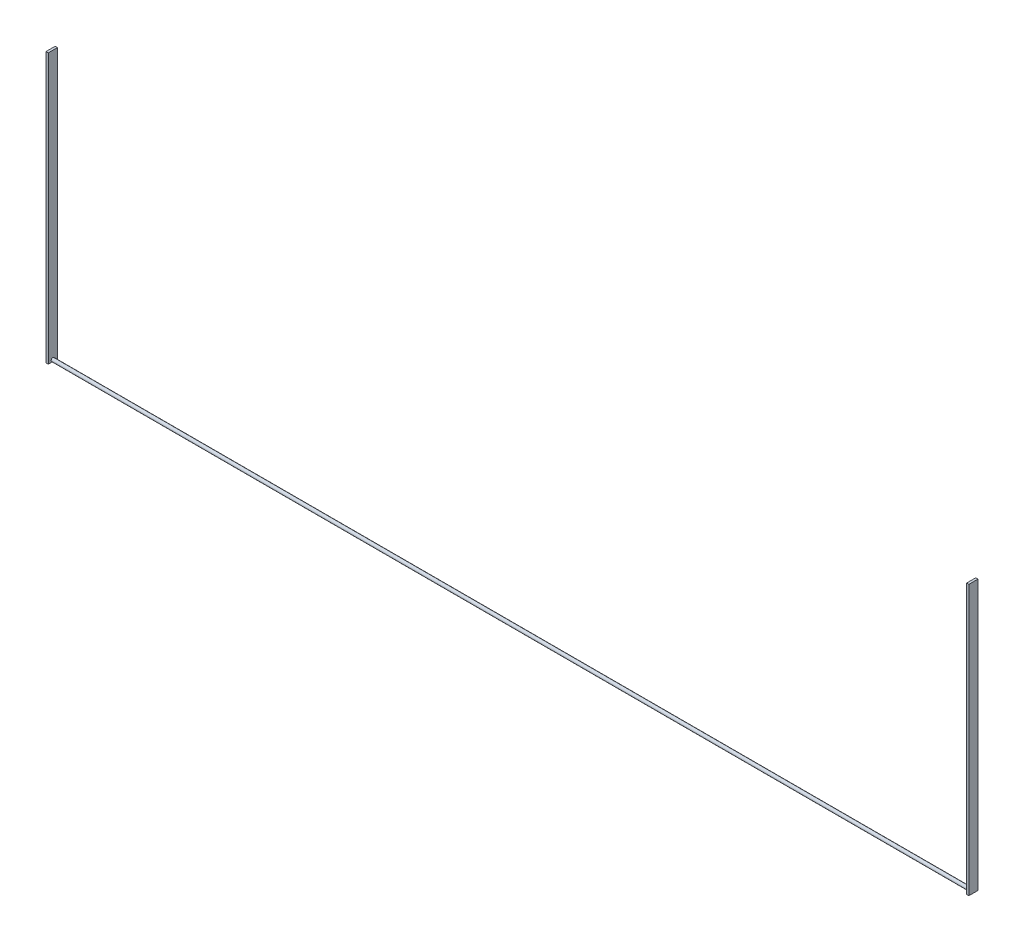
ISO-10303-21;
HEADER;
FILE_DESCRIPTION(('STEP AP214'),'2;1');
FILE_NAME('part.step','',(''),(''),'','','');
FILE_SCHEMA(('AUTOMOTIVE_DESIGN { 1 0 10303 214 1 1 1 1 }'));
ENDSEC;
DATA;
#1=APPLICATION_CONTEXT('core data for automotive mechanical design processes');
#2=APPLICATION_PROTOCOL_DEFINITION('international standard','automotive_design',2000,#1);
#3=PRODUCT_CONTEXT('',#1,'mechanical');
#4=PRODUCT('Part','Part','',(#3));
#5=PRODUCT_RELATED_PRODUCT_CATEGORY('part','',(#4));
#6=PRODUCT_DEFINITION_FORMATION('','',#4);
#7=PRODUCT_DEFINITION_CONTEXT('part definition',#1,'design');
#8=PRODUCT_DEFINITION('design','',#6,#7);
#9=PRODUCT_DEFINITION_SHAPE('','',#8);
#10=(LENGTH_UNIT() NAMED_UNIT(*) SI_UNIT(.MILLI.,.METRE.));
#11=(NAMED_UNIT(*) PLANE_ANGLE_UNIT() SI_UNIT($,.RADIAN.));
#12=(NAMED_UNIT(*) SI_UNIT($,.STERADIAN.) SOLID_ANGLE_UNIT());
#13=UNCERTAINTY_MEASURE_WITH_UNIT(LENGTH_MEASURE(1.E-05),#10,'distance_accuracy_value','');
#14=(GEOMETRIC_REPRESENTATION_CONTEXT(3) GLOBAL_UNCERTAINTY_ASSIGNED_CONTEXT((#13)) GLOBAL_UNIT_ASSIGNED_CONTEXT((#10,
#11,#12)) REPRESENTATION_CONTEXT('',''));
#15=CARTESIAN_POINT('',(0.,0.,0.));
#16=DIRECTION('',(0.,0.,1.));
#17=DIRECTION('',(1.,0.,0.));
#18=AXIS2_PLACEMENT_3D('',#15,#16,#17);
#19=CARTESIAN_POINT('',(6.35,0.,25.4));
#20=DIRECTION('',(0.,1.,0.));
#21=DIRECTION('',(0.,0.,1.));
#22=AXIS2_PLACEMENT_3D('',#19,#20,#21);
#23=PLANE('',#22);
#24=DIRECTION('',(1.,0.,0.));
#25=VECTOR('',#24,1.);
#26=CARTESIAN_POINT('',(6.35,0.,0.));
#27=LINE('',#26,#25);
#28=CARTESIAN_POINT('',(0.,0.,0.));
#29=VERTEX_POINT('',#28);
#30=CARTESIAN_POINT('',(6.35,0.,0.));
#31=VERTEX_POINT('',#30);
#32=EDGE_CURVE('E138',#29,#31,#27,.T.);
#33=ORIENTED_EDGE('',*,*,#32,.T.);
#34=DIRECTION('',(0.,0.,-1.));
#35=VECTOR('',#34,1.);
#36=CARTESIAN_POINT('',(6.35,0.,25.4));
#37=LINE('',#36,#35);
#38=CARTESIAN_POINT('',(6.35,0.,25.4));
#39=VERTEX_POINT('',#38);
#40=EDGE_CURVE('E43',#39,#31,#37,.T.);
#41=ORIENTED_EDGE('',*,*,#40,.F.);
#42=DIRECTION('',(1.,0.,0.));
#43=VECTOR('',#42,1.);
#44=CARTESIAN_POINT('',(6.35,0.,25.4));
#45=LINE('',#44,#43);
#46=CARTESIAN_POINT('',(0.,0.,25.4));
#47=VERTEX_POINT('',#46);
#48=EDGE_CURVE('E144',#47,#39,#45,.T.);
#49=ORIENTED_EDGE('',*,*,#48,.F.);
#50=DIRECTION('',(0.,0.,-1.));
#51=VECTOR('',#50,1.);
#52=CARTESIAN_POINT('',(0.,0.,25.4));
#53=LINE('',#52,#51);
#54=EDGE_CURVE('E150',#47,#29,#53,.T.);
#55=ORIENTED_EDGE('',*,*,#54,.T.);
#56=EDGE_LOOP('',(#33,#41,#49,#55));
#57=FACE_BOUND('',#56,.T.);
#58=ADVANCED_FACE('F35',(#57),#23,.F.);
#59=CARTESIAN_POINT('',(6.35000000000001,750.,25.4));
#60=DIRECTION('',(-1.,0.,0.));
#61=DIRECTION('',(0.,-1.,0.));
#62=AXIS2_PLACEMENT_3D('',#59,#60,#61);
#63=PLANE('',#62);
#64=CARTESIAN_POINT('',(6.34999999999986,5.,12.7));
#65=DIRECTION('',(-1.,0.,0.));
#66=DIRECTION('',(0.,-1.,0.));
#67=AXIS2_PLACEMENT_3D('',#64,#65,#66);
#68=CIRCLE('',#67,4.7625);
#69=CARTESIAN_POINT('',(6.34999999999986,0.237500000000001,12.7));
#70=VERTEX_POINT('',#69);
#71=EDGE_CURVE('E11',#70,#70,#68,.F.);
#72=ORIENTED_EDGE('',*,*,#71,.F.);
#73=EDGE_LOOP('',(#72));
#74=FACE_BOUND('',#73,.T.);
#75=DIRECTION('',(0.,1.,0.));
#76=VECTOR('',#75,1.);
#77=CARTESIAN_POINT('',(6.35000000000001,750.,0.));
#78=LINE('',#77,#76);
#79=CARTESIAN_POINT('',(6.35000000000001,750.,0.));
#80=VERTEX_POINT('',#79);
#81=EDGE_CURVE('E153',#31,#80,#78,.T.);
#82=ORIENTED_EDGE('',*,*,#81,.T.);
#83=DIRECTION('',(0.,0.,-1.));
#84=VECTOR('',#83,1.);
#85=CARTESIAN_POINT('',(6.35000000000001,750.,25.4));
#86=LINE('',#85,#84);
#87=CARTESIAN_POINT('',(6.35000000000001,750.,25.4));
#88=VERTEX_POINT('',#87);
#89=EDGE_CURVE('E160',#88,#80,#86,.T.);
#90=ORIENTED_EDGE('',*,*,#89,.F.);
#91=DIRECTION('',(0.,1.,0.));
#92=VECTOR('',#91,1.);
#93=CARTESIAN_POINT('',(6.35000000000001,750.,25.4));
#94=LINE('',#93,#92);
#95=EDGE_CURVE('E83',#39,#88,#94,.T.);
#96=ORIENTED_EDGE('',*,*,#95,.F.);
#97=ORIENTED_EDGE('',*,*,#40,.T.);
#98=EDGE_LOOP('',(#82,#90,#96,#97));
#99=FACE_BOUND('',#98,.T.);
#100=ADVANCED_FACE('F162',(#74,#99),#63,.F.);
#101=CARTESIAN_POINT('',(0.,750.,25.4));
#102=DIRECTION('',(0.,-1.,0.));
#103=DIRECTION('',(0.,0.,-1.));
#104=AXIS2_PLACEMENT_3D('',#101,#102,#103);
#105=PLANE('',#104);
#106=DIRECTION('',(-1.,0.,0.));
#107=VECTOR('',#106,1.);
#108=CARTESIAN_POINT('',(0.,750.,0.));
#109=LINE('',#108,#107);
#110=CARTESIAN_POINT('',(0.,750.,0.));
#111=VERTEX_POINT('',#110);
#112=EDGE_CURVE('E69',#80,#111,#109,.T.);
#113=ORIENTED_EDGE('',*,*,#112,.T.);
#114=DIRECTION('',(0.,0.,-1.));
#115=VECTOR('',#114,1.);
#116=CARTESIAN_POINT('',(0.,750.,25.4));
#117=LINE('',#116,#115);
#118=CARTESIAN_POINT('',(0.,750.,25.4));
#119=VERTEX_POINT('',#118);
#120=EDGE_CURVE('E158',#119,#111,#117,.T.);
#121=ORIENTED_EDGE('',*,*,#120,.F.);
#122=DIRECTION('',(-1.,0.,0.));
#123=VECTOR('',#122,1.);
#124=CARTESIAN_POINT('',(0.,750.,25.4));
#125=LINE('',#124,#123);
#126=EDGE_CURVE('E147',#88,#119,#125,.T.);
#127=ORIENTED_EDGE('',*,*,#126,.F.);
#128=ORIENTED_EDGE('',*,*,#89,.T.);
#129=EDGE_LOOP('',(#113,#121,#127,#128));
#130=FACE_BOUND('',#129,.T.);
#131=ADVANCED_FACE('F185',(#130),#105,.F.);
#132=CARTESIAN_POINT('',(0.,0.,25.4));
#133=DIRECTION('',(1.,0.,0.));
#134=DIRECTION('',(0.,0.,-1.));
#135=AXIS2_PLACEMENT_3D('',#132,#133,#134);
#136=PLANE('',#135);
#137=DIRECTION('',(0.,-1.,0.));
#138=VECTOR('',#137,1.);
#139=CARTESIAN_POINT('',(0.,0.,0.));
#140=LINE('',#139,#138);
#141=EDGE_CURVE('E75',#111,#29,#140,.T.);
#142=ORIENTED_EDGE('',*,*,#141,.T.);
#143=ORIENTED_EDGE('',*,*,#54,.F.);
#144=DIRECTION('',(0.,-1.,0.));
#145=VECTOR('',#144,1.);
#146=CARTESIAN_POINT('',(0.,0.,25.4));
#147=LINE('',#146,#145);
#148=EDGE_CURVE('E51',#119,#47,#147,.T.);
#149=ORIENTED_EDGE('',*,*,#148,.F.);
#150=ORIENTED_EDGE('',*,*,#120,.T.);
#151=EDGE_LOOP('',(#142,#143,#149,#150));
#152=FACE_BOUND('',#151,.T.);
#153=ADVANCED_FACE('F178',(#152),#136,.F.);
#154=CARTESIAN_POINT('',(0.,0.,25.4));
#155=DIRECTION('',(0.,0.,-1.));
#156=DIRECTION('',(-1.,0.,0.));
#157=AXIS2_PLACEMENT_3D('',#154,#155,#156);
#158=PLANE('',#157);
#159=ORIENTED_EDGE('',*,*,#48,.T.);
#160=ORIENTED_EDGE('',*,*,#95,.T.);
#161=ORIENTED_EDGE('',*,*,#126,.T.);
#162=ORIENTED_EDGE('',*,*,#148,.T.);
#163=EDGE_LOOP('',(#159,#160,#161,#162));
#164=FACE_BOUND('',#163,.T.);
#165=ADVANCED_FACE('F170',(#164),#158,.F.);
#166=CARTESIAN_POINT('',(0.,0.,0.));
#167=DIRECTION('',(0.,0.,-1.));
#168=DIRECTION('',(-1.,0.,0.));
#169=AXIS2_PLACEMENT_3D('',#166,#167,#168);
#170=PLANE('',#169);
#171=ORIENTED_EDGE('',*,*,#32,.F.);
#172=ORIENTED_EDGE('',*,*,#141,.F.);
#173=ORIENTED_EDGE('',*,*,#112,.F.);
#174=ORIENTED_EDGE('',*,*,#81,.F.);
#175=EDGE_LOOP('',(#171,#172,#173,#174));
#176=FACE_BOUND('',#175,.T.);
#177=ADVANCED_FACE('F167',(#176),#170,.T.);
#178=CARTESIAN_POINT('',(2573.8203841816,5.00000000000029,12.7));
#179=DIRECTION('',(-1.,0.,0.));
#180=DIRECTION('',(0.,-1.,0.));
#181=AXIS2_PLACEMENT_3D('',#178,#179,#180);
#182=CYLINDRICAL_SURFACE('',#181,4.7625);
#183=ORIENTED_EDGE('',*,*,#71,.T.);
#184=EDGE_LOOP('',(#183));
#185=FACE_BOUND('',#184,.T.);
#186=CARTESIAN_POINT('',(2560.35,5.00000000000028,12.7));
#187=DIRECTION('',(1.,0.,0.));
#188=DIRECTION('',(0.,1.,0.));
#189=AXIS2_PLACEMENT_3D('',#186,#187,#188);
#190=CIRCLE('',#189,4.7625);
#191=CARTESIAN_POINT('',(2560.35,9.76250000000029,12.7));
#192=VERTEX_POINT('',#191);
#193=EDGE_CURVE('E135',#192,#192,#190,.T.);
#194=ORIENTED_EDGE('',*,*,#193,.F.);
#195=EDGE_LOOP('',(#194));
#196=FACE_BOUND('',#195,.T.);
#197=ADVANCED_FACE('F169',(#185,#196),#182,.T.);
#198=CARTESIAN_POINT('',(2560.35,750.,25.4));
#199=DIRECTION('',(1.,0.,0.));
#200=DIRECTION('',(0.,1.,0.));
#201=AXIS2_PLACEMENT_3D('',#198,#199,#200);
#202=PLANE('',#201);
#203=ORIENTED_EDGE('',*,*,#193,.T.);
#204=EDGE_LOOP('',(#203));
#205=FACE_BOUND('',#204,.T.);
#206=DIRECTION('',(0.,-1.,0.));
#207=VECTOR('',#206,1.);
#208=CARTESIAN_POINT('',(2560.35,750.,0.));
#209=LINE('',#208,#207);
#210=CARTESIAN_POINT('',(2560.35,750.,0.));
#211=VERTEX_POINT('',#210);
#212=CARTESIAN_POINT('',(2560.35,0.,0.));
#213=VERTEX_POINT('',#212);
#214=EDGE_CURVE('E134',#211,#213,#209,.T.);
#215=ORIENTED_EDGE('',*,*,#214,.T.);
#216=DIRECTION('',(0.,0.,-1.));
#217=VECTOR('',#216,1.);
#218=CARTESIAN_POINT('',(2560.35,0.,25.4));
#219=LINE('',#218,#217);
#220=CARTESIAN_POINT('',(2560.35,0.,25.4));
#221=VERTEX_POINT('',#220);
#222=EDGE_CURVE('E114',#221,#213,#219,.T.);
#223=ORIENTED_EDGE('',*,*,#222,.F.);
#224=DIRECTION('',(0.,-1.,0.));
#225=VECTOR('',#224,1.);
#226=CARTESIAN_POINT('',(2560.35,750.,25.4));
#227=LINE('',#226,#225);
#228=CARTESIAN_POINT('',(2560.35,750.,25.4));
#229=VERTEX_POINT('',#228);
#230=EDGE_CURVE('E121',#229,#221,#227,.T.);
#231=ORIENTED_EDGE('',*,*,#230,.F.);
#232=DIRECTION('',(0.,0.,-1.));
#233=VECTOR('',#232,1.);
#234=CARTESIAN_POINT('',(2560.35,750.,25.4));
#235=LINE('',#234,#233);
#236=EDGE_CURVE('E287',#229,#211,#235,.T.);
#237=ORIENTED_EDGE('',*,*,#236,.T.);
#238=EDGE_LOOP('',(#215,#223,#231,#237));
#239=FACE_BOUND('',#238,.T.);
#240=ADVANCED_FACE('F132',(#205,#239),#202,.F.);
#241=CARTESIAN_POINT('',(2560.35,0.,25.4));
#242=DIRECTION('',(0.,1.,0.));
#243=DIRECTION('',(0.,0.,1.));
#244=AXIS2_PLACEMENT_3D('',#241,#242,#243);
#245=PLANE('',#244);
#246=DIRECTION('',(1.,0.,0.));
#247=VECTOR('',#246,1.);
#248=CARTESIAN_POINT('',(2560.35,0.,0.));
#249=LINE('',#248,#247);
#250=CARTESIAN_POINT('',(2566.7,0.,0.));
#251=VERTEX_POINT('',#250);
#252=EDGE_CURVE('E278',#213,#251,#249,.T.);
#253=ORIENTED_EDGE('',*,*,#252,.T.);
#254=DIRECTION('',(0.,0.,-1.));
#255=VECTOR('',#254,1.);
#256=CARTESIAN_POINT('',(2566.7,0.,25.4));
#257=LINE('',#256,#255);
#258=CARTESIAN_POINT('',(2566.7,0.,25.4));
#259=VERTEX_POINT('',#258);
#260=EDGE_CURVE('E117',#259,#251,#257,.T.);
#261=ORIENTED_EDGE('',*,*,#260,.F.);
#262=DIRECTION('',(1.,0.,0.));
#263=VECTOR('',#262,1.);
#264=CARTESIAN_POINT('',(2560.35,0.,25.4));
#265=LINE('',#264,#263);
#266=EDGE_CURVE('E110',#221,#259,#265,.T.);
#267=ORIENTED_EDGE('',*,*,#266,.F.);
#268=ORIENTED_EDGE('',*,*,#222,.T.);
#269=EDGE_LOOP('',(#253,#261,#267,#268));
#270=FACE_BOUND('',#269,.T.);
#271=ADVANCED_FACE('F112',(#270),#245,.F.);
#272=CARTESIAN_POINT('',(2566.7,0.,25.4));
#273=DIRECTION('',(-1.,0.,0.));
#274=DIRECTION('',(0.,0.,1.));
#275=AXIS2_PLACEMENT_3D('',#272,#273,#274);
#276=PLANE('',#275);
#277=DIRECTION('',(0.,1.,0.));
#278=VECTOR('',#277,1.);
#279=CARTESIAN_POINT('',(2566.7,0.,0.));
#280=LINE('',#279,#278);
#281=CARTESIAN_POINT('',(2566.7,750.,0.));
#282=VERTEX_POINT('',#281);
#283=EDGE_CURVE('E280',#251,#282,#280,.T.);
#284=ORIENTED_EDGE('',*,*,#283,.T.);
#285=DIRECTION('',(0.,0.,-1.));
#286=VECTOR('',#285,1.);
#287=CARTESIAN_POINT('',(2566.7,750.,25.4));
#288=LINE('',#287,#286);
#289=CARTESIAN_POINT('',(2566.7,750.,25.4));
#290=VERTEX_POINT('',#289);
#291=EDGE_CURVE('E140',#290,#282,#288,.T.);
#292=ORIENTED_EDGE('',*,*,#291,.F.);
#293=DIRECTION('',(0.,1.,0.));
#294=VECTOR('',#293,1.);
#295=CARTESIAN_POINT('',(2566.7,0.,25.4));
#296=LINE('',#295,#294);
#297=EDGE_CURVE('E120',#259,#290,#296,.T.);
#298=ORIENTED_EDGE('',*,*,#297,.F.);
#299=ORIENTED_EDGE('',*,*,#260,.T.);
#300=EDGE_LOOP('',(#284,#292,#298,#299));
#301=FACE_BOUND('',#300,.T.);
#302=ADVANCED_FACE('F236',(#301),#276,.F.);
#303=CARTESIAN_POINT('',(2566.7,750.,25.4));
#304=DIRECTION('',(0.,-1.,0.));
#305=DIRECTION('',(0.,0.,-1.));
#306=AXIS2_PLACEMENT_3D('',#303,#304,#305);
#307=PLANE('',#306);
#308=DIRECTION('',(-1.,0.,0.));
#309=VECTOR('',#308,1.);
#310=CARTESIAN_POINT('',(2566.7,750.,0.));
#311=LINE('',#310,#309);
#312=EDGE_CURVE('E130',#282,#211,#311,.T.);
#313=ORIENTED_EDGE('',*,*,#312,.T.);
#314=ORIENTED_EDGE('',*,*,#236,.F.);
#315=DIRECTION('',(-1.,0.,0.));
#316=VECTOR('',#315,1.);
#317=CARTESIAN_POINT('',(2566.7,750.,25.4));
#318=LINE('',#317,#316);
#319=EDGE_CURVE('E126',#290,#229,#318,.T.);
#320=ORIENTED_EDGE('',*,*,#319,.F.);
#321=ORIENTED_EDGE('',*,*,#291,.T.);
#322=EDGE_LOOP('',(#313,#314,#320,#321));
#323=FACE_BOUND('',#322,.T.);
#324=ADVANCED_FACE('F245',(#323),#307,.F.);
#325=CARTESIAN_POINT('',(0.,0.,25.4));
#326=DIRECTION('',(0.,0.,1.));
#327=DIRECTION('',(1.,0.,0.));
#328=AXIS2_PLACEMENT_3D('',#325,#326,#327);
#329=PLANE('',#328);
#330=ORIENTED_EDGE('',*,*,#230,.T.);
#331=ORIENTED_EDGE('',*,*,#266,.T.);
#332=ORIENTED_EDGE('',*,*,#297,.T.);
#333=ORIENTED_EDGE('',*,*,#319,.T.);
#334=EDGE_LOOP('',(#330,#331,#332,#333));
#335=FACE_BOUND('',#334,.T.);
#336=ADVANCED_FACE('F124',(#335),#329,.T.);
#337=CARTESIAN_POINT('',(0.,0.,0.));
#338=DIRECTION('',(0.,0.,1.));
#339=DIRECTION('',(1.,0.,0.));
#340=AXIS2_PLACEMENT_3D('',#337,#338,#339);
#341=PLANE('',#340);
#342=ORIENTED_EDGE('',*,*,#214,.F.);
#343=ORIENTED_EDGE('',*,*,#312,.F.);
#344=ORIENTED_EDGE('',*,*,#283,.F.);
#345=ORIENTED_EDGE('',*,*,#252,.F.);
#346=EDGE_LOOP('',(#342,#343,#344,#345));
#347=FACE_BOUND('',#346,.T.);
#348=ADVANCED_FACE('F264',(#347),#341,.F.);
#349=CLOSED_SHELL('',(#58,#100,#131,#153,#165,#177,#197,#240,#271,#302,#324,#336,#348));
#350=MANIFOLD_SOLID_BREP('B2',#349);
#351=ADVANCED_BREP_SHAPE_REPRESENTATION('',(#18,#350),#14);
#352=SHAPE_DEFINITION_REPRESENTATION(#9,#351);
ENDSEC;
END-ISO-10303-21;
